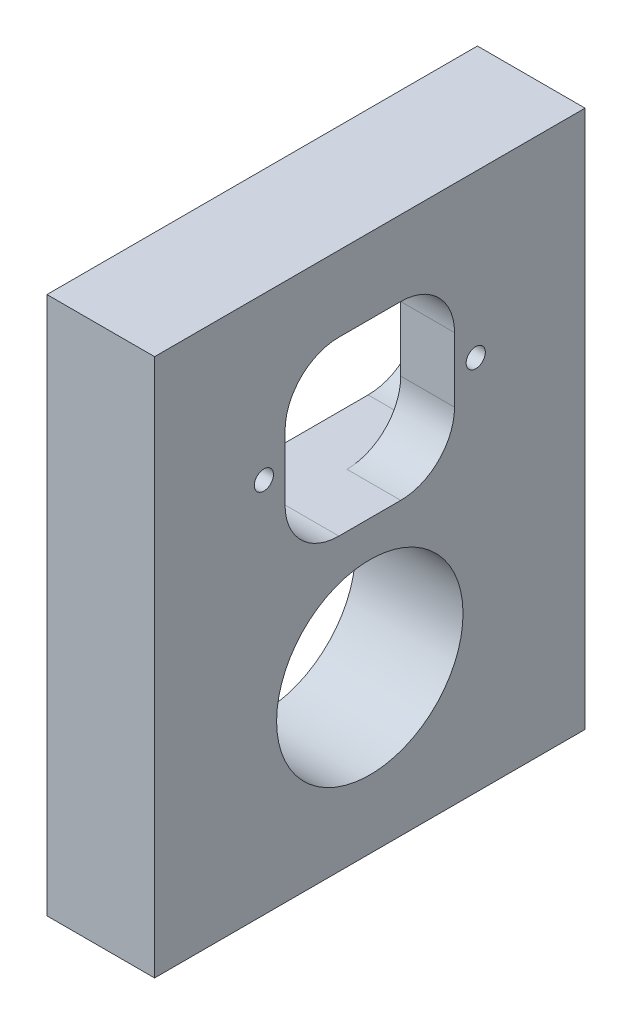
ISO-10303-21;
HEADER;
FILE_DESCRIPTION(('STEP AP214'),'2;1');
FILE_NAME('part.step','',(''),(''),'','','');
FILE_SCHEMA(('AUTOMOTIVE_DESIGN { 1 0 10303 214 1 1 1 1 }'));
ENDSEC;
DATA;
#1=APPLICATION_CONTEXT('core data for automotive mechanical design processes');
#2=APPLICATION_PROTOCOL_DEFINITION('international standard','automotive_design',2000,#1);
#3=PRODUCT_CONTEXT('',#1,'mechanical');
#4=PRODUCT('Part','Part','',(#3));
#5=PRODUCT_RELATED_PRODUCT_CATEGORY('part','',(#4));
#6=PRODUCT_DEFINITION_FORMATION('','',#4);
#7=PRODUCT_DEFINITION_CONTEXT('part definition',#1,'design');
#8=PRODUCT_DEFINITION('design','',#6,#7);
#9=PRODUCT_DEFINITION_SHAPE('','',#8);
#10=(LENGTH_UNIT() NAMED_UNIT(*) SI_UNIT(.MILLI.,.METRE.));
#11=(NAMED_UNIT(*) PLANE_ANGLE_UNIT() SI_UNIT($,.RADIAN.));
#12=(NAMED_UNIT(*) SI_UNIT($,.STERADIAN.) SOLID_ANGLE_UNIT());
#13=UNCERTAINTY_MEASURE_WITH_UNIT(LENGTH_MEASURE(1.E-05),#10,'distance_accuracy_value','');
#14=(GEOMETRIC_REPRESENTATION_CONTEXT(3) GLOBAL_UNCERTAINTY_ASSIGNED_CONTEXT((#13)) GLOBAL_UNIT_ASSIGNED_CONTEXT((#10,
#11,#12)) REPRESENTATION_CONTEXT('',''));
#15=CARTESIAN_POINT('',(0.,0.,0.));
#16=DIRECTION('',(0.,0.,1.));
#17=DIRECTION('',(1.,0.,0.));
#18=AXIS2_PLACEMENT_3D('',#15,#16,#17);
#19=CARTESIAN_POINT('',(0.,0.,0.));
#20=DIRECTION('',(-1.,0.,0.));
#21=DIRECTION('',(0.,0.,1.));
#22=AXIS2_PLACEMENT_3D('',#19,#20,#21);
#23=PLANE('',#22);
#24=CARTESIAN_POINT('',(0.,-12.7,0.));
#25=DIRECTION('',(1.,0.,0.));
#26=DIRECTION('',(0.,0.,-1.));
#27=AXIS2_PLACEMENT_3D('',#24,#25,#26);
#28=CIRCLE('',#27,11.);
#29=CARTESIAN_POINT('',(0.,-12.7,-11.));
#30=VERTEX_POINT('',#29);
#31=EDGE_CURVE('E270',#30,#30,#28,.T.);
#32=ORIENTED_EDGE('',*,*,#31,.T.);
#33=EDGE_LOOP('',(#32));
#34=FACE_BOUND('',#33,.T.);
#35=DIRECTION('',(0.,1.,0.));
#36=VECTOR('',#35,1.);
#37=CARTESIAN_POINT('',(0.,-31.75,-25.4));
#38=LINE('',#37,#36);
#39=CARTESIAN_POINT('',(0.,-31.75,-25.4));
#40=VERTEX_POINT('',#39);
#41=CARTESIAN_POINT('',(0.,31.75,-25.4));
#42=VERTEX_POINT('',#41);
#43=EDGE_CURVE('E273',#40,#42,#38,.T.);
#44=ORIENTED_EDGE('',*,*,#43,.F.);
#45=DIRECTION('',(0.,0.,-1.));
#46=VECTOR('',#45,1.);
#47=CARTESIAN_POINT('',(0.,-31.75,25.4));
#48=LINE('',#47,#46);
#49=CARTESIAN_POINT('',(0.,-31.75,25.4));
#50=VERTEX_POINT('',#49);
#51=EDGE_CURVE('E278',#50,#40,#48,.T.);
#52=ORIENTED_EDGE('',*,*,#51,.F.);
#53=DIRECTION('',(0.,-1.,0.));
#54=VECTOR('',#53,1.);
#55=CARTESIAN_POINT('',(0.,-31.75,25.4));
#56=LINE('',#55,#54);
#57=CARTESIAN_POINT('',(0.,31.75,25.4));
#58=VERTEX_POINT('',#57);
#59=EDGE_CURVE('E289',#58,#50,#56,.T.);
#60=ORIENTED_EDGE('',*,*,#59,.F.);
#61=DIRECTION('',(0.,0.,1.));
#62=VECTOR('',#61,1.);
#63=CARTESIAN_POINT('',(0.,31.75,25.4));
#64=LINE('',#63,#62);
#65=EDGE_CURVE('E287',#42,#58,#64,.T.);
#66=ORIENTED_EDGE('',*,*,#65,.F.);
#67=EDGE_LOOP('',(#44,#52,#60,#66));
#68=FACE_BOUND('',#67,.T.);
#69=DIRECTION('',(0.,0.,1.));
#70=VECTOR('',#69,1.);
#71=CARTESIAN_POINT('',(0.,22.86,3.65));
#72=LINE('',#71,#70);
#73=CARTESIAN_POINT('',(0.,22.86,-12.5));
#74=VERTEX_POINT('',#73);
#75=CARTESIAN_POINT('',(0.,22.86,12.5));
#76=VERTEX_POINT('',#75);
#77=EDGE_CURVE('E194',#74,#76,#72,.T.);
#78=ORIENTED_EDGE('',*,*,#77,.T.);
#79=CARTESIAN_POINT('',(0.,16.51,12.5));
#80=DIRECTION('',(1.,0.,0.));
#81=DIRECTION('',(0.,0.,1.));
#82=AXIS2_PLACEMENT_3D('',#79,#80,#81);
#83=CIRCLE('',#82,6.35);
#84=CARTESIAN_POINT('',(0.,16.51,18.85));
#85=VERTEX_POINT('',#84);
#86=EDGE_CURVE('E465',#76,#85,#83,.T.);
#87=ORIENTED_EDGE('',*,*,#86,.T.);
#88=DIRECTION('',(0.,-1.,0.));
#89=VECTOR('',#88,1.);
#90=CARTESIAN_POINT('',(0.,8.88999999999999,18.85));
#91=LINE('',#90,#89);
#92=CARTESIAN_POINT('',(0.,8.88999999999999,18.85));
#93=VERTEX_POINT('',#92);
#94=EDGE_CURVE('E447',#85,#93,#91,.T.);
#95=ORIENTED_EDGE('',*,*,#94,.T.);
#96=CARTESIAN_POINT('',(0.,8.88999999999999,12.5));
#97=DIRECTION('',(1.,0.,0.));
#98=DIRECTION('',(0.,0.,1.));
#99=AXIS2_PLACEMENT_3D('',#96,#97,#98);
#100=CIRCLE('',#99,6.35);
#101=CARTESIAN_POINT('',(0.,2.53999999999999,12.5));
#102=VERTEX_POINT('',#101);
#103=EDGE_CURVE('E445',#93,#102,#100,.T.);
#104=ORIENTED_EDGE('',*,*,#103,.T.);
#105=DIRECTION('',(0.,0.,-1.));
#106=VECTOR('',#105,1.);
#107=CARTESIAN_POINT('',(0.,2.53999999999999,3.65));
#108=LINE('',#107,#106);
#109=CARTESIAN_POINT('',(0.,2.53999999999999,-12.5));
#110=VERTEX_POINT('',#109);
#111=EDGE_CURVE('E220',#102,#110,#108,.T.);
#112=ORIENTED_EDGE('',*,*,#111,.T.);
#113=CARTESIAN_POINT('',(0.,8.88999999999999,-12.5));
#114=DIRECTION('',(1.,0.,0.));
#115=DIRECTION('',(0.,0.,-1.));
#116=AXIS2_PLACEMENT_3D('',#113,#114,#115);
#117=CIRCLE('',#116,6.35);
#118=CARTESIAN_POINT('',(0.,8.88999999999999,-18.85));
#119=VERTEX_POINT('',#118);
#120=EDGE_CURVE('E439',#110,#119,#117,.T.);
#121=ORIENTED_EDGE('',*,*,#120,.T.);
#122=DIRECTION('',(0.,1.,0.));
#123=VECTOR('',#122,1.);
#124=CARTESIAN_POINT('',(0.,8.88999999999999,-18.85));
#125=LINE('',#124,#123);
#126=CARTESIAN_POINT('',(0.,16.51,-18.85));
#127=VERTEX_POINT('',#126);
#128=EDGE_CURVE('E190',#119,#127,#125,.T.);
#129=ORIENTED_EDGE('',*,*,#128,.T.);
#130=CARTESIAN_POINT('',(0.,16.51,-12.5));
#131=DIRECTION('',(1.,0.,0.));
#132=DIRECTION('',(0.,0.,1.));
#133=AXIS2_PLACEMENT_3D('',#130,#131,#132);
#134=CIRCLE('',#133,6.35);
#135=EDGE_CURVE('E470',#127,#74,#134,.T.);
#136=ORIENTED_EDGE('',*,*,#135,.T.);
#137=EDGE_LOOP('',(#78,#87,#95,#104,#112,#121,#129,#136));
#138=FACE_BOUND('',#137,.T.);
#139=ADVANCED_FACE('F33',(#34,#68,#138),#23,.T.);
#140=CARTESIAN_POINT('',(12.7,12.7,-12.5));
#141=DIRECTION('',(1.,0.,0.));
#142=DIRECTION('',(0.,0.,-1.));
#143=AXIS2_PLACEMENT_3D('',#140,#141,#142);
#144=CYLINDRICAL_SURFACE('',#143,1.13029999999999);
#145=CARTESIAN_POINT('',(12.7,12.7,-12.5));
#146=DIRECTION('',(1.,0.,0.));
#147=DIRECTION('',(0.,0.,-1.));
#148=AXIS2_PLACEMENT_3D('',#145,#146,#147);
#149=CIRCLE('',#148,1.13029999999999);
#150=CARTESIAN_POINT('',(12.7,12.7,-13.6303));
#151=VERTEX_POINT('',#150);
#152=EDGE_CURVE('E264',#151,#151,#149,.T.);
#153=ORIENTED_EDGE('',*,*,#152,.T.);
#154=EDGE_LOOP('',(#153));
#155=FACE_BOUND('',#154,.T.);
#156=CARTESIAN_POINT('',(6.35,12.7,-12.5));
#157=DIRECTION('',(-1.,0.,0.));
#158=DIRECTION('',(0.,0.,1.));
#159=AXIS2_PLACEMENT_3D('',#156,#157,#158);
#160=CIRCLE('',#159,1.13029999999999);
#161=CARTESIAN_POINT('',(6.35,12.7,-11.3697));
#162=VERTEX_POINT('',#161);
#163=EDGE_CURVE('E215',#162,#162,#160,.F.);
#164=ORIENTED_EDGE('',*,*,#163,.F.);
#165=EDGE_LOOP('',(#164));
#166=FACE_BOUND('',#165,.T.);
#167=ADVANCED_FACE('F326',(#155,#166),#144,.F.);
#168=CARTESIAN_POINT('',(12.7,12.7,12.5));
#169=DIRECTION('',(1.,0.,0.));
#170=DIRECTION('',(0.,0.,-1.));
#171=AXIS2_PLACEMENT_3D('',#168,#169,#170);
#172=CYLINDRICAL_SURFACE('',#171,1.13029999999999);
#173=CARTESIAN_POINT('',(12.7,12.7,12.5));
#174=DIRECTION('',(1.,0.,0.));
#175=DIRECTION('',(0.,0.,-1.));
#176=AXIS2_PLACEMENT_3D('',#173,#174,#175);
#177=CIRCLE('',#176,1.13029999999999);
#178=CARTESIAN_POINT('',(12.7,12.7,11.3697));
#179=VERTEX_POINT('',#178);
#180=EDGE_CURVE('E248',#179,#179,#177,.T.);
#181=ORIENTED_EDGE('',*,*,#180,.T.);
#182=EDGE_LOOP('',(#181));
#183=FACE_BOUND('',#182,.T.);
#184=CARTESIAN_POINT('',(6.35,12.7,12.5));
#185=DIRECTION('',(-1.,0.,0.));
#186=DIRECTION('',(0.,0.,1.));
#187=AXIS2_PLACEMENT_3D('',#184,#185,#186);
#188=CIRCLE('',#187,1.13029999999999);
#189=CARTESIAN_POINT('',(6.35,12.7,13.6303));
#190=VERTEX_POINT('',#189);
#191=EDGE_CURVE('E212',#190,#190,#188,.F.);
#192=ORIENTED_EDGE('',*,*,#191,.F.);
#193=EDGE_LOOP('',(#192));
#194=FACE_BOUND('',#193,.T.);
#195=ADVANCED_FACE('F334',(#183,#194),#172,.F.);
#196=CARTESIAN_POINT('',(0.,16.51,-3.65000000000001));
#197=DIRECTION('',(1.,0.,0.));
#198=DIRECTION('',(0.,0.,-1.));
#199=AXIS2_PLACEMENT_3D('',#196,#197,#198);
#200=CYLINDRICAL_SURFACE('',#199,6.35);
#201=CARTESIAN_POINT('',(6.35,16.51,-3.65000000000001));
#202=DIRECTION('',(-1.,0.,0.));
#203=DIRECTION('',(0.,0.,1.));
#204=AXIS2_PLACEMENT_3D('',#201,#202,#203);
#205=CIRCLE('',#204,6.35);
#206=CARTESIAN_POINT('',(6.35,16.51,-10.));
#207=VERTEX_POINT('',#206);
#208=CARTESIAN_POINT('',(6.35,22.86,-3.65000000000001));
#209=VERTEX_POINT('',#208);
#210=EDGE_CURVE('E176',#207,#209,#205,.F.);
#211=ORIENTED_EDGE('',*,*,#210,.F.);
#212=DIRECTION('',(1.,0.,0.));
#213=VECTOR('',#212,1.);
#214=CARTESIAN_POINT('',(0.,16.51,-10.));
#215=LINE('',#214,#213);
#216=CARTESIAN_POINT('',(12.7,16.51,-10.));
#217=VERTEX_POINT('',#216);
#218=EDGE_CURVE('E246',#207,#217,#215,.T.);
#219=ORIENTED_EDGE('',*,*,#218,.T.);
#220=CARTESIAN_POINT('',(12.7,16.51,-3.65000000000001));
#221=DIRECTION('',(1.,0.,0.));
#222=DIRECTION('',(0.,0.,1.));
#223=AXIS2_PLACEMENT_3D('',#220,#221,#222);
#224=CIRCLE('',#223,6.35);
#225=CARTESIAN_POINT('',(12.7,22.86,-3.65000000000001));
#226=VERTEX_POINT('',#225);
#227=EDGE_CURVE('E218',#217,#226,#224,.T.);
#228=ORIENTED_EDGE('',*,*,#227,.T.);
#229=DIRECTION('',(1.,0.,0.));
#230=VECTOR('',#229,1.);
#231=CARTESIAN_POINT('',(0.,22.86,-3.65000000000001));
#232=LINE('',#231,#230);
#233=EDGE_CURVE('E223',#209,#226,#232,.T.);
#234=ORIENTED_EDGE('',*,*,#233,.F.);
#235=EDGE_LOOP('',(#211,#219,#228,#234));
#236=FACE_BOUND('',#235,.T.);
#237=ADVANCED_FACE('F393',(#236),#200,.F.);
#238=CARTESIAN_POINT('',(0.,8.88999999999999,-10.));
#239=DIRECTION('',(0.,0.,-1.));
#240=DIRECTION('',(-1.,0.,0.));
#241=AXIS2_PLACEMENT_3D('',#238,#239,#240);
#242=PLANE('',#241);
#243=DIRECTION('',(0.,1.,0.));
#244=VECTOR('',#243,1.);
#245=CARTESIAN_POINT('',(6.35,8.88999999999999,-10.));
#246=LINE('',#245,#244);
#247=CARTESIAN_POINT('',(6.35,8.88999999999999,-10.));
#248=VERTEX_POINT('',#247);
#249=EDGE_CURVE('E209',#248,#207,#246,.T.);
#250=ORIENTED_EDGE('',*,*,#249,.F.);
#251=DIRECTION('',(1.,0.,0.));
#252=VECTOR('',#251,1.);
#253=CARTESIAN_POINT('',(0.,8.88999999999999,-10.));
#254=LINE('',#253,#252);
#255=CARTESIAN_POINT('',(12.7,8.88999999999999,-10.));
#256=VERTEX_POINT('',#255);
#257=EDGE_CURVE('E249',#248,#256,#254,.T.);
#258=ORIENTED_EDGE('',*,*,#257,.T.);
#259=DIRECTION('',(0.,1.,0.));
#260=VECTOR('',#259,1.);
#261=CARTESIAN_POINT('',(12.7,8.88999999999999,-10.));
#262=LINE('',#261,#260);
#263=EDGE_CURVE('E221',#256,#217,#262,.T.);
#264=ORIENTED_EDGE('',*,*,#263,.T.);
#265=ORIENTED_EDGE('',*,*,#218,.F.);
#266=EDGE_LOOP('',(#250,#258,#264,#265));
#267=FACE_BOUND('',#266,.T.);
#268=ADVANCED_FACE('F399',(#267),#242,.F.);
#269=CARTESIAN_POINT('',(0.,8.88999999999999,-3.65000000000001));
#270=DIRECTION('',(1.,0.,0.));
#271=DIRECTION('',(0.,0.,-1.));
#272=AXIS2_PLACEMENT_3D('',#269,#270,#271);
#273=CYLINDRICAL_SURFACE('',#272,6.35);
#274=CARTESIAN_POINT('',(6.35,8.88999999999999,-3.65000000000001));
#275=DIRECTION('',(-1.,0.,0.));
#276=DIRECTION('',(0.,0.,1.));
#277=AXIS2_PLACEMENT_3D('',#274,#275,#276);
#278=CIRCLE('',#277,6.35);
#279=CARTESIAN_POINT('',(6.35,2.53999999999999,-3.65000000000001));
#280=VERTEX_POINT('',#279);
#281=EDGE_CURVE('E207',#280,#248,#278,.F.);
#282=ORIENTED_EDGE('',*,*,#281,.F.);
#283=DIRECTION('',(1.,0.,0.));
#284=VECTOR('',#283,1.);
#285=CARTESIAN_POINT('',(0.,2.53999999999999,-3.65000000000001));
#286=LINE('',#285,#284);
#287=CARTESIAN_POINT('',(12.7,2.53999999999999,-3.65000000000001));
#288=VERTEX_POINT('',#287);
#289=EDGE_CURVE('E251',#280,#288,#286,.T.);
#290=ORIENTED_EDGE('',*,*,#289,.T.);
#291=CARTESIAN_POINT('',(12.7,8.88999999999999,-3.65000000000001));
#292=DIRECTION('',(1.,0.,0.));
#293=DIRECTION('',(0.,0.,-1.));
#294=AXIS2_PLACEMENT_3D('',#291,#292,#293);
#295=CIRCLE('',#294,6.35);
#296=EDGE_CURVE('E241',#288,#256,#295,.T.);
#297=ORIENTED_EDGE('',*,*,#296,.T.);
#298=ORIENTED_EDGE('',*,*,#257,.F.);
#299=EDGE_LOOP('',(#282,#290,#297,#298));
#300=FACE_BOUND('',#299,.T.);
#301=ADVANCED_FACE('F413',(#300),#273,.F.);
#302=CARTESIAN_POINT('',(0.,8.88999999999999,3.65));
#303=DIRECTION('',(1.,0.,0.));
#304=DIRECTION('',(0.,0.,-1.));
#305=AXIS2_PLACEMENT_3D('',#302,#303,#304);
#306=CYLINDRICAL_SURFACE('',#305,6.35);
#307=CARTESIAN_POINT('',(6.35,8.88999999999999,3.65));
#308=DIRECTION('',(-1.,0.,0.));
#309=DIRECTION('',(0.,0.,1.));
#310=AXIS2_PLACEMENT_3D('',#307,#308,#309);
#311=CIRCLE('',#310,6.35);
#312=CARTESIAN_POINT('',(6.35,8.88999999999999,9.99999999999999));
#313=VERTEX_POINT('',#312);
#314=CARTESIAN_POINT('',(6.35,2.53999999999999,3.65));
#315=VERTEX_POINT('',#314);
#316=EDGE_CURVE('E205',#313,#315,#311,.F.);
#317=ORIENTED_EDGE('',*,*,#316,.F.);
#318=DIRECTION('',(1.,0.,0.));
#319=VECTOR('',#318,1.);
#320=CARTESIAN_POINT('',(0.,8.88999999999999,9.99999999999999));
#321=LINE('',#320,#319);
#322=CARTESIAN_POINT('',(12.7,8.88999999999999,9.99999999999999));
#323=VERTEX_POINT('',#322);
#324=EDGE_CURVE('E255',#313,#323,#321,.T.);
#325=ORIENTED_EDGE('',*,*,#324,.T.);
#326=CARTESIAN_POINT('',(12.7,8.88999999999999,3.65));
#327=DIRECTION('',(1.,0.,0.));
#328=DIRECTION('',(0.,0.,-1.));
#329=AXIS2_PLACEMENT_3D('',#326,#327,#328);
#330=CIRCLE('',#329,6.35);
#331=CARTESIAN_POINT('',(12.7,2.53999999999999,3.65));
#332=VERTEX_POINT('',#331);
#333=EDGE_CURVE('E235',#323,#332,#330,.T.);
#334=ORIENTED_EDGE('',*,*,#333,.T.);
#335=DIRECTION('',(1.,0.,0.));
#336=VECTOR('',#335,1.);
#337=CARTESIAN_POINT('',(0.,2.53999999999999,3.65));
#338=LINE('',#337,#336);
#339=EDGE_CURVE('E253',#315,#332,#338,.T.);
#340=ORIENTED_EDGE('',*,*,#339,.F.);
#341=EDGE_LOOP('',(#317,#325,#334,#340));
#342=FACE_BOUND('',#341,.T.);
#343=ADVANCED_FACE('F409',(#342),#306,.F.);
#344=CARTESIAN_POINT('',(0.,8.88999999999999,9.99999999999999));
#345=DIRECTION('',(0.,0.,1.));
#346=DIRECTION('',(0.,-1.,0.));
#347=AXIS2_PLACEMENT_3D('',#344,#345,#346);
#348=PLANE('',#347);
#349=DIRECTION('',(0.,-1.,0.));
#350=VECTOR('',#349,1.);
#351=CARTESIAN_POINT('',(6.35,8.88999999999999,9.99999999999999));
#352=LINE('',#351,#350);
#353=CARTESIAN_POINT('',(6.35,16.51,10.));
#354=VERTEX_POINT('',#353);
#355=EDGE_CURVE('E198',#354,#313,#352,.T.);
#356=ORIENTED_EDGE('',*,*,#355,.F.);
#357=DIRECTION('',(1.,0.,0.));
#358=VECTOR('',#357,1.);
#359=CARTESIAN_POINT('',(0.,16.51,10.));
#360=LINE('',#359,#358);
#361=CARTESIAN_POINT('',(12.7,16.51,10.));
#362=VERTEX_POINT('',#361);
#363=EDGE_CURVE('E257',#354,#362,#360,.T.);
#364=ORIENTED_EDGE('',*,*,#363,.T.);
#365=DIRECTION('',(0.,-1.,0.));
#366=VECTOR('',#365,1.);
#367=CARTESIAN_POINT('',(12.7,8.88999999999999,9.99999999999999));
#368=LINE('',#367,#366);
#369=EDGE_CURVE('E232',#362,#323,#368,.T.);
#370=ORIENTED_EDGE('',*,*,#369,.T.);
#371=ORIENTED_EDGE('',*,*,#324,.F.);
#372=EDGE_LOOP('',(#356,#364,#370,#371));
#373=FACE_BOUND('',#372,.T.);
#374=ADVANCED_FACE('F405',(#373),#348,.F.);
#375=CARTESIAN_POINT('',(0.,16.51,3.65));
#376=DIRECTION('',(1.,0.,0.));
#377=DIRECTION('',(0.,0.,-1.));
#378=AXIS2_PLACEMENT_3D('',#375,#376,#377);
#379=CYLINDRICAL_SURFACE('',#378,6.35);
#380=CARTESIAN_POINT('',(6.35,16.51,3.65));
#381=DIRECTION('',(-1.,0.,0.));
#382=DIRECTION('',(0.,0.,1.));
#383=AXIS2_PLACEMENT_3D('',#380,#381,#382);
#384=CIRCLE('',#383,6.35);
#385=CARTESIAN_POINT('',(6.35,22.86,3.65));
#386=VERTEX_POINT('',#385);
#387=EDGE_CURVE('E195',#386,#354,#384,.F.);
#388=ORIENTED_EDGE('',*,*,#387,.F.);
#389=DIRECTION('',(1.,0.,0.));
#390=VECTOR('',#389,1.);
#391=CARTESIAN_POINT('',(0.,22.86,3.65));
#392=LINE('',#391,#390);
#393=CARTESIAN_POINT('',(12.7,22.86,3.65));
#394=VERTEX_POINT('',#393);
#395=EDGE_CURVE('E259',#386,#394,#392,.T.);
#396=ORIENTED_EDGE('',*,*,#395,.T.);
#397=CARTESIAN_POINT('',(12.7,16.51,3.65));
#398=DIRECTION('',(1.,0.,0.));
#399=DIRECTION('',(0.,0.,-1.));
#400=AXIS2_PLACEMENT_3D('',#397,#398,#399);
#401=CIRCLE('',#400,6.35);
#402=EDGE_CURVE('E229',#394,#362,#401,.T.);
#403=ORIENTED_EDGE('',*,*,#402,.T.);
#404=ORIENTED_EDGE('',*,*,#363,.F.);
#405=EDGE_LOOP('',(#388,#396,#403,#404));
#406=FACE_BOUND('',#405,.T.);
#407=ADVANCED_FACE('F324',(#406),#379,.F.);
#408=CARTESIAN_POINT('',(12.7,-31.75,-25.4));
#409=DIRECTION('',(0.,0.,1.));
#410=DIRECTION('',(1.,0.,0.));
#411=AXIS2_PLACEMENT_3D('',#408,#409,#410);
#412=PLANE('',#411);
#413=ORIENTED_EDGE('',*,*,#43,.T.);
#414=DIRECTION('',(-1.,0.,0.));
#415=VECTOR('',#414,1.);
#416=CARTESIAN_POINT('',(12.7,31.75,-25.4));
#417=LINE('',#416,#415);
#418=CARTESIAN_POINT('',(12.7,31.75,-25.4));
#419=VERTEX_POINT('',#418);
#420=EDGE_CURVE('E11',#419,#42,#417,.T.);
#421=ORIENTED_EDGE('',*,*,#420,.F.);
#422=DIRECTION('',(0.,1.,0.));
#423=VECTOR('',#422,1.);
#424=CARTESIAN_POINT('',(12.7,-31.75,-25.4));
#425=LINE('',#424,#423);
#426=CARTESIAN_POINT('',(12.7,-31.75,-25.4));
#427=VERTEX_POINT('',#426);
#428=EDGE_CURVE('E274',#427,#419,#425,.T.);
#429=ORIENTED_EDGE('',*,*,#428,.F.);
#430=DIRECTION('',(-1.,0.,0.));
#431=VECTOR('',#430,1.);
#432=CARTESIAN_POINT('',(12.7,-31.75,-25.4));
#433=LINE('',#432,#431);
#434=EDGE_CURVE('E284',#427,#40,#433,.T.);
#435=ORIENTED_EDGE('',*,*,#434,.T.);
#436=EDGE_LOOP('',(#413,#421,#429,#435));
#437=FACE_BOUND('',#436,.T.);
#438=ADVANCED_FACE('F35',(#437),#412,.F.);
#439=CARTESIAN_POINT('',(12.7,31.75,25.4));
#440=DIRECTION('',(0.,-1.,0.));
#441=DIRECTION('',(0.,0.,-1.));
#442=AXIS2_PLACEMENT_3D('',#439,#440,#441);
#443=PLANE('',#442);
#444=ORIENTED_EDGE('',*,*,#65,.T.);
#445=DIRECTION('',(-1.,0.,0.));
#446=VECTOR('',#445,1.);
#447=CARTESIAN_POINT('',(12.7,31.75,25.4));
#448=LINE('',#447,#446);
#449=CARTESIAN_POINT('',(12.7,31.75,25.4));
#450=VERTEX_POINT('',#449);
#451=EDGE_CURVE('E41',#450,#58,#448,.T.);
#452=ORIENTED_EDGE('',*,*,#451,.F.);
#453=DIRECTION('',(0.,0.,1.));
#454=VECTOR('',#453,1.);
#455=CARTESIAN_POINT('',(12.7,31.75,25.4));
#456=LINE('',#455,#454);
#457=EDGE_CURVE('E277',#419,#450,#456,.T.);
#458=ORIENTED_EDGE('',*,*,#457,.F.);
#459=ORIENTED_EDGE('',*,*,#420,.T.);
#460=EDGE_LOOP('',(#444,#452,#458,#459));
#461=FACE_BOUND('',#460,.T.);
#462=ADVANCED_FACE('F317',(#461),#443,.F.);
#463=CARTESIAN_POINT('',(12.7,-31.75,25.4));
#464=DIRECTION('',(0.,0.,-1.));
#465=DIRECTION('',(-1.,0.,0.));
#466=AXIS2_PLACEMENT_3D('',#463,#464,#465);
#467=PLANE('',#466);
#468=ORIENTED_EDGE('',*,*,#59,.T.);
#469=DIRECTION('',(-1.,0.,0.));
#470=VECTOR('',#469,1.);
#471=CARTESIAN_POINT('',(12.7,-31.75,25.4));
#472=LINE('',#471,#470);
#473=CARTESIAN_POINT('',(12.7,-31.75,25.4));
#474=VERTEX_POINT('',#473);
#475=EDGE_CURVE('E294',#474,#50,#472,.T.);
#476=ORIENTED_EDGE('',*,*,#475,.F.);
#477=DIRECTION('',(0.,-1.,0.));
#478=VECTOR('',#477,1.);
#479=CARTESIAN_POINT('',(12.7,-31.75,25.4));
#480=LINE('',#479,#478);
#481=EDGE_CURVE('E280',#450,#474,#480,.T.);
#482=ORIENTED_EDGE('',*,*,#481,.F.);
#483=ORIENTED_EDGE('',*,*,#451,.T.);
#484=EDGE_LOOP('',(#468,#476,#482,#483));
#485=FACE_BOUND('',#484,.T.);
#486=ADVANCED_FACE('F301',(#485),#467,.F.);
#487=CARTESIAN_POINT('',(12.7,-31.75,25.4));
#488=DIRECTION('',(0.,1.,0.));
#489=DIRECTION('',(0.,0.,1.));
#490=AXIS2_PLACEMENT_3D('',#487,#488,#489);
#491=PLANE('',#490);
#492=ORIENTED_EDGE('',*,*,#51,.T.);
#493=ORIENTED_EDGE('',*,*,#434,.F.);
#494=DIRECTION('',(0.,0.,-1.));
#495=VECTOR('',#494,1.);
#496=CARTESIAN_POINT('',(12.7,-31.75,25.4));
#497=LINE('',#496,#495);
#498=EDGE_CURVE('E282',#474,#427,#497,.T.);
#499=ORIENTED_EDGE('',*,*,#498,.F.);
#500=ORIENTED_EDGE('',*,*,#475,.T.);
#501=EDGE_LOOP('',(#492,#493,#499,#500));
#502=FACE_BOUND('',#501,.T.);
#503=ADVANCED_FACE('F310',(#502),#491,.F.);
#504=CARTESIAN_POINT('',(12.7,0.,0.));
#505=DIRECTION('',(-1.,0.,0.));
#506=DIRECTION('',(0.,0.,1.));
#507=AXIS2_PLACEMENT_3D('',#504,#505,#506);
#508=PLANE('',#507);
#509=DIRECTION('',(0.,0.,1.));
#510=VECTOR('',#509,1.);
#511=CARTESIAN_POINT('',(12.7,22.86,3.65));
#512=LINE('',#511,#510);
#513=EDGE_CURVE('E226',#226,#394,#512,.T.);
#514=ORIENTED_EDGE('',*,*,#513,.F.);
#515=ORIENTED_EDGE('',*,*,#227,.F.);
#516=ORIENTED_EDGE('',*,*,#263,.F.);
#517=ORIENTED_EDGE('',*,*,#296,.F.);
#518=DIRECTION('',(0.,0.,-1.));
#519=VECTOR('',#518,1.);
#520=CARTESIAN_POINT('',(12.7,2.53999999999999,3.65));
#521=LINE('',#520,#519);
#522=EDGE_CURVE('E238',#332,#288,#521,.T.);
#523=ORIENTED_EDGE('',*,*,#522,.F.);
#524=ORIENTED_EDGE('',*,*,#333,.F.);
#525=ORIENTED_EDGE('',*,*,#369,.F.);
#526=ORIENTED_EDGE('',*,*,#402,.F.);
#527=EDGE_LOOP('',(#514,#515,#516,#517,#523,#524,#525,#526));
#528=FACE_BOUND('',#527,.T.);
#529=ORIENTED_EDGE('',*,*,#180,.F.);
#530=EDGE_LOOP('',(#529));
#531=FACE_BOUND('',#530,.T.);
#532=ORIENTED_EDGE('',*,*,#152,.F.);
#533=EDGE_LOOP('',(#532));
#534=FACE_BOUND('',#533,.T.);
#535=CARTESIAN_POINT('',(12.7,-12.7,0.));
#536=DIRECTION('',(1.,0.,0.));
#537=DIRECTION('',(0.,0.,-1.));
#538=AXIS2_PLACEMENT_3D('',#535,#536,#537);
#539=CIRCLE('',#538,11.);
#540=CARTESIAN_POINT('',(12.7,-12.7,-11.));
#541=VERTEX_POINT('',#540);
#542=EDGE_CURVE('E267',#541,#541,#539,.T.);
#543=ORIENTED_EDGE('',*,*,#542,.F.);
#544=EDGE_LOOP('',(#543));
#545=FACE_BOUND('',#544,.T.);
#546=ORIENTED_EDGE('',*,*,#428,.T.);
#547=ORIENTED_EDGE('',*,*,#457,.T.);
#548=ORIENTED_EDGE('',*,*,#481,.T.);
#549=ORIENTED_EDGE('',*,*,#498,.T.);
#550=EDGE_LOOP('',(#546,#547,#548,#549));
#551=FACE_BOUND('',#550,.T.);
#552=ADVANCED_FACE('F316',(#528,#531,#534,#545,#551),#508,.F.);
#553=CARTESIAN_POINT('',(12.7,-12.7,0.));
#554=DIRECTION('',(1.,0.,0.));
#555=DIRECTION('',(0.,0.,-1.));
#556=AXIS2_PLACEMENT_3D('',#553,#554,#555);
#557=CYLINDRICAL_SURFACE('',#556,11.);
#558=ORIENTED_EDGE('',*,*,#31,.F.);
#559=EDGE_LOOP('',(#558));
#560=FACE_BOUND('',#559,.T.);
#561=ORIENTED_EDGE('',*,*,#542,.T.);
#562=EDGE_LOOP('',(#561));
#563=FACE_BOUND('',#562,.T.);
#564=ADVANCED_FACE('F344',(#560,#563),#557,.F.);
#565=CARTESIAN_POINT('',(0.,2.53999999999999,3.65));
#566=DIRECTION('',(0.,-1.,0.));
#567=DIRECTION('',(0.,0.,-1.));
#568=AXIS2_PLACEMENT_3D('',#565,#566,#567);
#569=PLANE('',#568);
#570=ORIENTED_EDGE('',*,*,#111,.F.);
#571=DIRECTION('',(-1.,0.,0.));
#572=VECTOR('',#571,1.);
#573=CARTESIAN_POINT('',(6.35,2.53999999999999,12.5));
#574=LINE('',#573,#572);
#575=CARTESIAN_POINT('',(6.35,2.53999999999999,12.5));
#576=VERTEX_POINT('',#575);
#577=EDGE_CURVE('E456',#576,#102,#574,.T.);
#578=ORIENTED_EDGE('',*,*,#577,.F.);
#579=DIRECTION('',(0.,0.,-1.));
#580=VECTOR('',#579,1.);
#581=CARTESIAN_POINT('',(6.35,2.53999999999999,12.5));
#582=LINE('',#581,#580);
#583=EDGE_CURVE('E477',#576,#315,#582,.T.);
#584=ORIENTED_EDGE('',*,*,#583,.T.);
#585=ORIENTED_EDGE('',*,*,#339,.T.);
#586=ORIENTED_EDGE('',*,*,#522,.T.);
#587=ORIENTED_EDGE('',*,*,#289,.F.);
#588=CARTESIAN_POINT('',(6.35,2.53999999999999,-12.5));
#589=VERTEX_POINT('',#588);
#590=EDGE_CURVE('E48',#280,#589,#582,.T.);
#591=ORIENTED_EDGE('',*,*,#590,.T.);
#592=DIRECTION('',(-1.,0.,0.));
#593=VECTOR('',#592,1.);
#594=CARTESIAN_POINT('',(6.35,2.53999999999999,-12.5));
#595=LINE('',#594,#593);
#596=EDGE_CURVE('E454',#589,#110,#595,.T.);
#597=ORIENTED_EDGE('',*,*,#596,.T.);
#598=EDGE_LOOP('',(#570,#578,#584,#585,#586,#587,#591,#597));
#599=FACE_BOUND('',#598,.T.);
#600=ADVANCED_FACE('F349',(#599),#569,.F.);
#601=CARTESIAN_POINT('',(0.,22.86,3.65));
#602=DIRECTION('',(0.,1.,0.));
#603=DIRECTION('',(0.,0.,1.));
#604=AXIS2_PLACEMENT_3D('',#601,#602,#603);
#605=PLANE('',#604);
#606=ORIENTED_EDGE('',*,*,#77,.F.);
#607=DIRECTION('',(-1.,0.,0.));
#608=VECTOR('',#607,1.);
#609=CARTESIAN_POINT('',(6.35,22.86,-12.5));
#610=LINE('',#609,#608);
#611=CARTESIAN_POINT('',(6.35,22.86,-12.5));
#612=VERTEX_POINT('',#611);
#613=EDGE_CURVE('E187',#612,#74,#610,.T.);
#614=ORIENTED_EDGE('',*,*,#613,.F.);
#615=DIRECTION('',(0.,0.,1.));
#616=VECTOR('',#615,1.);
#617=CARTESIAN_POINT('',(6.35,22.86,12.5));
#618=LINE('',#617,#616);
#619=EDGE_CURVE('E169',#612,#209,#618,.T.);
#620=ORIENTED_EDGE('',*,*,#619,.T.);
#621=ORIENTED_EDGE('',*,*,#233,.T.);
#622=ORIENTED_EDGE('',*,*,#513,.T.);
#623=ORIENTED_EDGE('',*,*,#395,.F.);
#624=CARTESIAN_POINT('',(6.35,22.86,12.5));
#625=VERTEX_POINT('',#624);
#626=EDGE_CURVE('E56',#386,#625,#618,.T.);
#627=ORIENTED_EDGE('',*,*,#626,.T.);
#628=DIRECTION('',(-1.,0.,0.));
#629=VECTOR('',#628,1.);
#630=CARTESIAN_POINT('',(6.35,22.86,12.5));
#631=LINE('',#630,#629);
#632=EDGE_CURVE('E196',#625,#76,#631,.T.);
#633=ORIENTED_EDGE('',*,*,#632,.T.);
#634=EDGE_LOOP('',(#606,#614,#620,#621,#622,#623,#627,#633));
#635=FACE_BOUND('',#634,.T.);
#636=ADVANCED_FACE('F192',(#635),#605,.F.);
#637=CARTESIAN_POINT('',(6.35,16.51,-12.5));
#638=DIRECTION('',(-1.,0.,0.));
#639=DIRECTION('',(0.,0.,1.));
#640=AXIS2_PLACEMENT_3D('',#637,#638,#639);
#641=PLANE('',#640);
#642=ORIENTED_EDGE('',*,*,#316,.T.);
#643=ORIENTED_EDGE('',*,*,#583,.F.);
#644=CARTESIAN_POINT('',(6.35,8.88999999999999,12.5));
#645=DIRECTION('',(1.,0.,0.));
#646=DIRECTION('',(0.,0.,1.));
#647=AXIS2_PLACEMENT_3D('',#644,#645,#646);
#648=CIRCLE('',#647,6.35);
#649=CARTESIAN_POINT('',(6.35,8.88999999999999,18.85));
#650=VERTEX_POINT('',#649);
#651=EDGE_CURVE('E479',#650,#576,#648,.T.);
#652=ORIENTED_EDGE('',*,*,#651,.F.);
#653=DIRECTION('',(0.,-1.,0.));
#654=VECTOR('',#653,1.);
#655=CARTESIAN_POINT('',(6.35,8.88999999999999,18.85));
#656=LINE('',#655,#654);
#657=CARTESIAN_POINT('',(6.35,16.51,18.85));
#658=VERTEX_POINT('',#657);
#659=EDGE_CURVE('E481',#658,#650,#656,.T.);
#660=ORIENTED_EDGE('',*,*,#659,.F.);
#661=CARTESIAN_POINT('',(6.35,16.51,12.5));
#662=DIRECTION('',(1.,0.,0.));
#663=DIRECTION('',(0.,0.,1.));
#664=AXIS2_PLACEMENT_3D('',#661,#662,#663);
#665=CIRCLE('',#664,6.35);
#666=EDGE_CURVE('E180',#625,#658,#665,.T.);
#667=ORIENTED_EDGE('',*,*,#666,.F.);
#668=ORIENTED_EDGE('',*,*,#626,.F.);
#669=ORIENTED_EDGE('',*,*,#387,.T.);
#670=ORIENTED_EDGE('',*,*,#355,.T.);
#671=EDGE_LOOP('',(#642,#643,#652,#660,#667,#668,#669,#670));
#672=FACE_BOUND('',#671,.T.);
#673=ORIENTED_EDGE('',*,*,#191,.T.);
#674=EDGE_LOOP('',(#673));
#675=FACE_BOUND('',#674,.T.);
#676=ADVANCED_FACE('F366',(#672,#675),#641,.T.);
#677=CARTESIAN_POINT('',(6.35,8.88999999999999,12.5));
#678=DIRECTION('',(-1.,0.,0.));
#679=DIRECTION('',(0.,0.,1.));
#680=AXIS2_PLACEMENT_3D('',#677,#678,#679);
#681=CYLINDRICAL_SURFACE('',#680,6.35);
#682=ORIENTED_EDGE('',*,*,#103,.F.);
#683=DIRECTION('',(-1.,0.,0.));
#684=VECTOR('',#683,1.);
#685=CARTESIAN_POINT('',(6.35,8.88999999999999,18.85));
#686=LINE('',#685,#684);
#687=EDGE_CURVE('E459',#650,#93,#686,.T.);
#688=ORIENTED_EDGE('',*,*,#687,.F.);
#689=ORIENTED_EDGE('',*,*,#651,.T.);
#690=ORIENTED_EDGE('',*,*,#577,.T.);
#691=EDGE_LOOP('',(#682,#688,#689,#690));
#692=FACE_BOUND('',#691,.T.);
#693=ADVANCED_FACE('F378',(#692),#681,.F.);
#694=CARTESIAN_POINT('',(6.35,8.88999999999999,18.85));
#695=DIRECTION('',(0.,0.,-1.));
#696=DIRECTION('',(-1.,0.,0.));
#697=AXIS2_PLACEMENT_3D('',#694,#695,#696);
#698=PLANE('',#697);
#699=ORIENTED_EDGE('',*,*,#94,.F.);
#700=DIRECTION('',(-1.,0.,0.));
#701=VECTOR('',#700,1.);
#702=CARTESIAN_POINT('',(6.35,16.51,18.85));
#703=LINE('',#702,#701);
#704=EDGE_CURVE('E200',#658,#85,#703,.T.);
#705=ORIENTED_EDGE('',*,*,#704,.F.);
#706=ORIENTED_EDGE('',*,*,#659,.T.);
#707=ORIENTED_EDGE('',*,*,#687,.T.);
#708=EDGE_LOOP('',(#699,#705,#706,#707));
#709=FACE_BOUND('',#708,.T.);
#710=ADVANCED_FACE('F373',(#709),#698,.T.);
#711=CARTESIAN_POINT('',(6.35,16.51,12.5));
#712=DIRECTION('',(-1.,0.,0.));
#713=DIRECTION('',(0.,0.,1.));
#714=AXIS2_PLACEMENT_3D('',#711,#712,#713);
#715=CYLINDRICAL_SURFACE('',#714,6.35);
#716=ORIENTED_EDGE('',*,*,#86,.F.);
#717=ORIENTED_EDGE('',*,*,#632,.F.);
#718=ORIENTED_EDGE('',*,*,#666,.T.);
#719=ORIENTED_EDGE('',*,*,#704,.T.);
#720=EDGE_LOOP('',(#716,#717,#718,#719));
#721=FACE_BOUND('',#720,.T.);
#722=ADVANCED_FACE('F364',(#721),#715,.F.);
#723=ORIENTED_EDGE('',*,*,#210,.T.);
#724=ORIENTED_EDGE('',*,*,#619,.F.);
#725=CARTESIAN_POINT('',(6.35,16.51,-12.5));
#726=DIRECTION('',(1.,0.,0.));
#727=DIRECTION('',(0.,0.,1.));
#728=AXIS2_PLACEMENT_3D('',#725,#726,#727);
#729=CIRCLE('',#728,6.35);
#730=CARTESIAN_POINT('',(6.35,16.51,-18.85));
#731=VERTEX_POINT('',#730);
#732=EDGE_CURVE('E174',#731,#612,#729,.T.);
#733=ORIENTED_EDGE('',*,*,#732,.F.);
#734=DIRECTION('',(0.,1.,0.));
#735=VECTOR('',#734,1.);
#736=CARTESIAN_POINT('',(6.35,8.88999999999999,-18.85));
#737=LINE('',#736,#735);
#738=CARTESIAN_POINT('',(6.35,8.88999999999999,-18.85));
#739=VERTEX_POINT('',#738);
#740=EDGE_CURVE('E452',#739,#731,#737,.T.);
#741=ORIENTED_EDGE('',*,*,#740,.F.);
#742=CARTESIAN_POINT('',(6.35,8.88999999999999,-12.5));
#743=DIRECTION('',(1.,0.,0.));
#744=DIRECTION('',(0.,0.,-1.));
#745=AXIS2_PLACEMENT_3D('',#742,#743,#744);
#746=CIRCLE('',#745,6.35);
#747=EDGE_CURVE('E475',#589,#739,#746,.T.);
#748=ORIENTED_EDGE('',*,*,#747,.F.);
#749=ORIENTED_EDGE('',*,*,#590,.F.);
#750=ORIENTED_EDGE('',*,*,#281,.T.);
#751=ORIENTED_EDGE('',*,*,#249,.T.);
#752=EDGE_LOOP('',(#723,#724,#733,#741,#748,#749,#750,#751));
#753=FACE_BOUND('',#752,.T.);
#754=ORIENTED_EDGE('',*,*,#163,.T.);
#755=EDGE_LOOP('',(#754));
#756=FACE_BOUND('',#755,.T.);
#757=ADVANCED_FACE('F171',(#753,#756),#641,.T.);
#758=CARTESIAN_POINT('',(6.35,16.51,-12.5));
#759=DIRECTION('',(-1.,0.,0.));
#760=DIRECTION('',(0.,0.,1.));
#761=AXIS2_PLACEMENT_3D('',#758,#759,#760);
#762=CYLINDRICAL_SURFACE('',#761,6.35);
#763=ORIENTED_EDGE('',*,*,#135,.F.);
#764=DIRECTION('',(-1.,0.,0.));
#765=VECTOR('',#764,1.);
#766=CARTESIAN_POINT('',(6.35,16.51,-18.85));
#767=LINE('',#766,#765);
#768=EDGE_CURVE('E189',#731,#127,#767,.T.);
#769=ORIENTED_EDGE('',*,*,#768,.F.);
#770=ORIENTED_EDGE('',*,*,#732,.T.);
#771=ORIENTED_EDGE('',*,*,#613,.T.);
#772=EDGE_LOOP('',(#763,#769,#770,#771));
#773=FACE_BOUND('',#772,.T.);
#774=ADVANCED_FACE('F186',(#773),#762,.F.);
#775=CARTESIAN_POINT('',(6.35,8.88999999999999,-12.5));
#776=DIRECTION('',(-1.,0.,0.));
#777=DIRECTION('',(0.,0.,1.));
#778=AXIS2_PLACEMENT_3D('',#775,#776,#777);
#779=CYLINDRICAL_SURFACE('',#778,6.35);
#780=ORIENTED_EDGE('',*,*,#120,.F.);
#781=ORIENTED_EDGE('',*,*,#596,.F.);
#782=ORIENTED_EDGE('',*,*,#747,.T.);
#783=DIRECTION('',(-1.,0.,0.));
#784=VECTOR('',#783,1.);
#785=CARTESIAN_POINT('',(6.35,8.88999999999999,-18.85));
#786=LINE('',#785,#784);
#787=EDGE_CURVE('E438',#739,#119,#786,.T.);
#788=ORIENTED_EDGE('',*,*,#787,.T.);
#789=EDGE_LOOP('',(#780,#781,#782,#788));
#790=FACE_BOUND('',#789,.T.);
#791=ADVANCED_FACE('F371',(#790),#779,.F.);
#792=CARTESIAN_POINT('',(6.35,8.88999999999999,-18.85));
#793=DIRECTION('',(0.,0.,1.));
#794=DIRECTION('',(0.,-1.,0.));
#795=AXIS2_PLACEMENT_3D('',#792,#793,#794);
#796=PLANE('',#795);
#797=ORIENTED_EDGE('',*,*,#128,.F.);
#798=ORIENTED_EDGE('',*,*,#787,.F.);
#799=ORIENTED_EDGE('',*,*,#740,.T.);
#800=ORIENTED_EDGE('',*,*,#768,.T.);
#801=EDGE_LOOP('',(#797,#798,#799,#800));
#802=FACE_BOUND('',#801,.T.);
#803=ADVANCED_FACE('F428',(#802),#796,.T.);
#804=CLOSED_SHELL('',(#139,#167,#195,#237,#268,#301,#343,#374,#407,#438,#462,#486,#503,#552,
#564,#600,#636,#676,#693,#710,#722,#757,#774,#791,#803));
#805=MANIFOLD_SOLID_BREP('B2',#804);
#806=ADVANCED_BREP_SHAPE_REPRESENTATION('',(#18,#805),#14);
#807=SHAPE_DEFINITION_REPRESENTATION(#9,#806);
ENDSEC;
END-ISO-10303-21;
